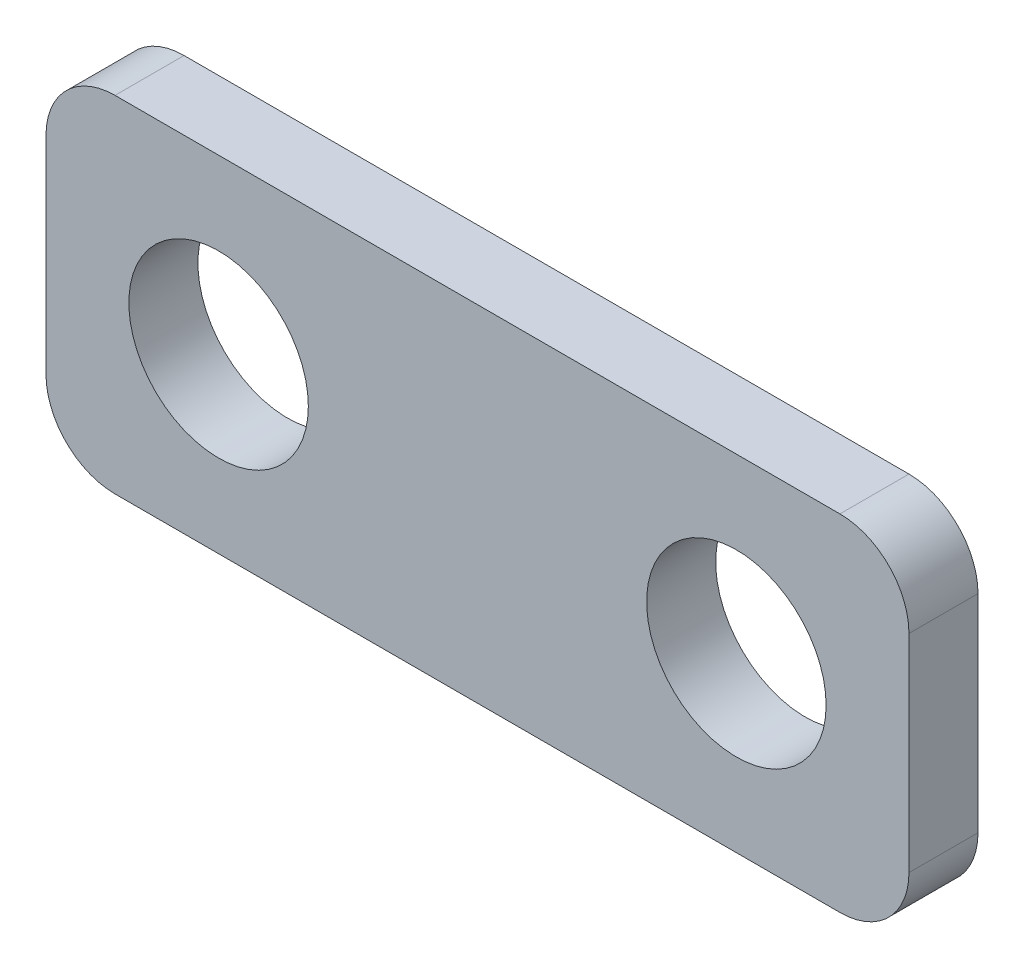
ISO-10303-21;
HEADER;
FILE_DESCRIPTION(('STEP AP214'),'2;1');
FILE_NAME('part.step','',(''),(''),'','','');
FILE_SCHEMA(('AUTOMOTIVE_DESIGN { 1 0 10303 214 1 1 1 1 }'));
ENDSEC;
DATA;
#1=APPLICATION_CONTEXT('core data for automotive mechanical design processes');
#2=APPLICATION_PROTOCOL_DEFINITION('international standard','automotive_design',2000,#1);
#3=PRODUCT_CONTEXT('',#1,'mechanical');
#4=PRODUCT('Part','Part','',(#3));
#5=PRODUCT_RELATED_PRODUCT_CATEGORY('part','',(#4));
#6=PRODUCT_DEFINITION_FORMATION('','',#4);
#7=PRODUCT_DEFINITION_CONTEXT('part definition',#1,'design');
#8=PRODUCT_DEFINITION('design','',#6,#7);
#9=PRODUCT_DEFINITION_SHAPE('','',#8);
#10=(LENGTH_UNIT() NAMED_UNIT(*) SI_UNIT(.MILLI.,.METRE.));
#11=(NAMED_UNIT(*) PLANE_ANGLE_UNIT() SI_UNIT($,.RADIAN.));
#12=(NAMED_UNIT(*) SI_UNIT($,.STERADIAN.) SOLID_ANGLE_UNIT());
#13=UNCERTAINTY_MEASURE_WITH_UNIT(LENGTH_MEASURE(1.E-05),#10,'distance_accuracy_value','');
#14=(GEOMETRIC_REPRESENTATION_CONTEXT(3) GLOBAL_UNCERTAINTY_ASSIGNED_CONTEXT((#13)) GLOBAL_UNIT_ASSIGNED_CONTEXT((#10,
#11,#12)) REPRESENTATION_CONTEXT('',''));
#15=CARTESIAN_POINT('',(0.,0.,0.));
#16=DIRECTION('',(0.,0.,1.));
#17=DIRECTION('',(1.,0.,0.));
#18=AXIS2_PLACEMENT_3D('',#15,#16,#17);
#19=CARTESIAN_POINT('',(29.21,2.54,2.54));
#20=DIRECTION('',(0.,0.,1.));
#21=DIRECTION('',(1.,0.,0.));
#22=AXIS2_PLACEMENT_3D('',#19,#20,#21);
#23=PLANE('',#22);
#24=CARTESIAN_POINT('',(6.35,6.35,2.54));
#25=DIRECTION('',(0.,0.,1.));
#26=DIRECTION('',(1.,0.,0.));
#27=AXIS2_PLACEMENT_3D('',#24,#25,#26);
#28=CIRCLE('',#27,3.302);
#29=CARTESIAN_POINT('',(9.652,6.35,2.54));
#30=VERTEX_POINT('',#29);
#31=EDGE_CURVE('E136',#30,#30,#28,.T.);
#32=ORIENTED_EDGE('',*,*,#31,.F.);
#33=EDGE_LOOP('',(#32));
#34=FACE_BOUND('',#33,.T.);
#35=CARTESIAN_POINT('',(29.21,2.54,2.54));
#36=DIRECTION('',(0.,0.,1.));
#37=DIRECTION('',(1.,0.,0.));
#38=AXIS2_PLACEMENT_3D('',#35,#36,#37);
#39=CIRCLE('',#38,2.54);
#40=CARTESIAN_POINT('',(29.21,0.,2.54));
#41=VERTEX_POINT('',#40);
#42=CARTESIAN_POINT('',(31.75,2.54000000000002,2.54));
#43=VERTEX_POINT('',#42);
#44=EDGE_CURVE('E147',#41,#43,#39,.T.);
#45=ORIENTED_EDGE('',*,*,#44,.T.);
#46=DIRECTION('',(0.,1.,0.));
#47=VECTOR('',#46,1.);
#48=CARTESIAN_POINT('',(31.75,2.54000000000002,2.54));
#49=LINE('',#48,#47);
#50=CARTESIAN_POINT('',(31.75,10.16,2.54));
#51=VERTEX_POINT('',#50);
#52=EDGE_CURVE('E95',#43,#51,#49,.T.);
#53=ORIENTED_EDGE('',*,*,#52,.T.);
#54=CARTESIAN_POINT('',(29.21,10.16,2.54));
#55=DIRECTION('',(0.,0.,1.));
#56=DIRECTION('',(-1.,0.,0.));
#57=AXIS2_PLACEMENT_3D('',#54,#55,#56);
#58=CIRCLE('',#57,2.54);
#59=CARTESIAN_POINT('',(29.21,12.7,2.54));
#60=VERTEX_POINT('',#59);
#61=EDGE_CURVE('E162',#51,#60,#58,.T.);
#62=ORIENTED_EDGE('',*,*,#61,.T.);
#63=DIRECTION('',(-1.,0.,0.));
#64=VECTOR('',#63,1.);
#65=CARTESIAN_POINT('',(2.54000000000002,12.7,2.54));
#66=LINE('',#65,#64);
#67=CARTESIAN_POINT('',(2.54000000000002,12.7,2.54));
#68=VERTEX_POINT('',#67);
#69=EDGE_CURVE('E175',#60,#68,#66,.T.);
#70=ORIENTED_EDGE('',*,*,#69,.T.);
#71=CARTESIAN_POINT('',(2.54,10.16,2.54));
#72=DIRECTION('',(0.,0.,1.));
#73=DIRECTION('',(-1.,0.,0.));
#74=AXIS2_PLACEMENT_3D('',#71,#72,#73);
#75=CIRCLE('',#74,2.54);
#76=CARTESIAN_POINT('',(0.,10.16,2.54));
#77=VERTEX_POINT('',#76);
#78=EDGE_CURVE('E114',#68,#77,#75,.T.);
#79=ORIENTED_EDGE('',*,*,#78,.T.);
#80=DIRECTION('',(0.,-1.,0.));
#81=VECTOR('',#80,1.);
#82=CARTESIAN_POINT('',(0.,2.54000000000002,2.54));
#83=LINE('',#82,#81);
#84=CARTESIAN_POINT('',(0.,2.54000000000002,2.54));
#85=VERTEX_POINT('',#84);
#86=EDGE_CURVE('E108',#77,#85,#83,.T.);
#87=ORIENTED_EDGE('',*,*,#86,.T.);
#88=CARTESIAN_POINT('',(2.54,2.54,2.54));
#89=DIRECTION('',(0.,0.,1.));
#90=DIRECTION('',(-1.,0.,0.));
#91=AXIS2_PLACEMENT_3D('',#88,#89,#90);
#92=CIRCLE('',#91,2.54);
#93=CARTESIAN_POINT('',(2.54000000000002,0.,2.54));
#94=VERTEX_POINT('',#93);
#95=EDGE_CURVE('E112',#85,#94,#92,.T.);
#96=ORIENTED_EDGE('',*,*,#95,.T.);
#97=DIRECTION('',(1.,0.,0.));
#98=VECTOR('',#97,1.);
#99=CARTESIAN_POINT('',(2.54000000000002,0.,2.54));
#100=LINE('',#99,#98);
#101=EDGE_CURVE('E52',#94,#41,#100,.T.);
#102=ORIENTED_EDGE('',*,*,#101,.T.);
#103=EDGE_LOOP('',(#45,#53,#62,#70,#79,#87,#96,#102));
#104=FACE_BOUND('',#103,.T.);
#105=CARTESIAN_POINT('',(25.4,6.35,2.54));
#106=DIRECTION('',(0.,0.,1.));
#107=DIRECTION('',(1.,0.,0.));
#108=AXIS2_PLACEMENT_3D('',#105,#106,#107);
#109=CIRCLE('',#108,3.302);
#110=CARTESIAN_POINT('',(28.702,6.35,2.54));
#111=VERTEX_POINT('',#110);
#112=EDGE_CURVE('E184',#111,#111,#109,.T.);
#113=ORIENTED_EDGE('',*,*,#112,.F.);
#114=EDGE_LOOP('',(#113));
#115=FACE_BOUND('',#114,.T.);
#116=ADVANCED_FACE('F35',(#34,#104,#115),#23,.T.);
#117=CARTESIAN_POINT('',(29.21,2.54,0.));
#118=DIRECTION('',(0.,0.,1.));
#119=DIRECTION('',(1.,0.,0.));
#120=AXIS2_PLACEMENT_3D('',#117,#118,#119);
#121=PLANE('',#120);
#122=CARTESIAN_POINT('',(29.21,2.54,0.));
#123=DIRECTION('',(0.,0.,1.));
#124=DIRECTION('',(1.,0.,0.));
#125=AXIS2_PLACEMENT_3D('',#122,#123,#124);
#126=CIRCLE('',#125,2.54);
#127=CARTESIAN_POINT('',(29.21,0.,0.));
#128=VERTEX_POINT('',#127);
#129=CARTESIAN_POINT('',(31.75,2.54000000000002,0.));
#130=VERTEX_POINT('',#129);
#131=EDGE_CURVE('E132',#128,#130,#126,.T.);
#132=ORIENTED_EDGE('',*,*,#131,.F.);
#133=DIRECTION('',(1.,0.,0.));
#134=VECTOR('',#133,1.);
#135=CARTESIAN_POINT('',(2.54000000000002,0.,0.));
#136=LINE('',#135,#134);
#137=CARTESIAN_POINT('',(2.54000000000002,0.,0.));
#138=VERTEX_POINT('',#137);
#139=EDGE_CURVE('E87',#138,#128,#136,.T.);
#140=ORIENTED_EDGE('',*,*,#139,.F.);
#141=CARTESIAN_POINT('',(2.54,2.54,0.));
#142=DIRECTION('',(0.,0.,1.));
#143=DIRECTION('',(-1.,0.,0.));
#144=AXIS2_PLACEMENT_3D('',#141,#142,#143);
#145=CIRCLE('',#144,2.54);
#146=CARTESIAN_POINT('',(0.,2.54000000000002,0.));
#147=VERTEX_POINT('',#146);
#148=EDGE_CURVE('E81',#147,#138,#145,.T.);
#149=ORIENTED_EDGE('',*,*,#148,.F.);
#150=DIRECTION('',(0.,-1.,0.));
#151=VECTOR('',#150,1.);
#152=CARTESIAN_POINT('',(0.,2.54000000000002,0.));
#153=LINE('',#152,#151);
#154=CARTESIAN_POINT('',(0.,10.16,0.));
#155=VERTEX_POINT('',#154);
#156=EDGE_CURVE('E122',#155,#147,#153,.T.);
#157=ORIENTED_EDGE('',*,*,#156,.F.);
#158=CARTESIAN_POINT('',(2.54,10.16,0.));
#159=DIRECTION('',(0.,0.,1.));
#160=DIRECTION('',(-1.,0.,0.));
#161=AXIS2_PLACEMENT_3D('',#158,#159,#160);
#162=CIRCLE('',#161,2.54);
#163=CARTESIAN_POINT('',(2.54000000000002,12.7,0.));
#164=VERTEX_POINT('',#163);
#165=EDGE_CURVE('E142',#164,#155,#162,.T.);
#166=ORIENTED_EDGE('',*,*,#165,.F.);
#167=DIRECTION('',(-1.,0.,0.));
#168=VECTOR('',#167,1.);
#169=CARTESIAN_POINT('',(2.54000000000002,12.7,0.));
#170=LINE('',#169,#168);
#171=CARTESIAN_POINT('',(29.21,12.7,0.));
#172=VERTEX_POINT('',#171);
#173=EDGE_CURVE('E140',#172,#164,#170,.T.);
#174=ORIENTED_EDGE('',*,*,#173,.F.);
#175=CARTESIAN_POINT('',(29.21,10.16,0.));
#176=DIRECTION('',(0.,0.,1.));
#177=DIRECTION('',(-1.,0.,0.));
#178=AXIS2_PLACEMENT_3D('',#175,#176,#177);
#179=CIRCLE('',#178,2.54);
#180=CARTESIAN_POINT('',(31.75,10.16,0.));
#181=VERTEX_POINT('',#180);
#182=EDGE_CURVE('E138',#181,#172,#179,.T.);
#183=ORIENTED_EDGE('',*,*,#182,.F.);
#184=DIRECTION('',(0.,1.,0.));
#185=VECTOR('',#184,1.);
#186=CARTESIAN_POINT('',(31.75,2.54000000000002,0.));
#187=LINE('',#186,#185);
#188=EDGE_CURVE('E135',#130,#181,#187,.T.);
#189=ORIENTED_EDGE('',*,*,#188,.F.);
#190=EDGE_LOOP('',(#132,#140,#149,#157,#166,#174,#183,#189));
#191=FACE_BOUND('',#190,.T.);
#192=CARTESIAN_POINT('',(6.35,6.35,0.));
#193=DIRECTION('',(0.,0.,1.));
#194=DIRECTION('',(1.,0.,0.));
#195=AXIS2_PLACEMENT_3D('',#192,#193,#194);
#196=CIRCLE('',#195,3.302);
#197=CARTESIAN_POINT('',(9.652,6.35,0.));
#198=VERTEX_POINT('',#197);
#199=EDGE_CURVE('E181',#198,#198,#196,.T.);
#200=ORIENTED_EDGE('',*,*,#199,.T.);
#201=EDGE_LOOP('',(#200));
#202=FACE_BOUND('',#201,.T.);
#203=CARTESIAN_POINT('',(25.4,6.35,0.));
#204=DIRECTION('',(0.,0.,1.));
#205=DIRECTION('',(1.,0.,0.));
#206=AXIS2_PLACEMENT_3D('',#203,#204,#205);
#207=CIRCLE('',#206,3.302);
#208=CARTESIAN_POINT('',(28.702,6.35,0.));
#209=VERTEX_POINT('',#208);
#210=EDGE_CURVE('E187',#209,#209,#207,.T.);
#211=ORIENTED_EDGE('',*,*,#210,.T.);
#212=EDGE_LOOP('',(#211));
#213=FACE_BOUND('',#212,.T.);
#214=ADVANCED_FACE('F166',(#191,#202,#213),#121,.F.);
#215=CARTESIAN_POINT('',(29.21,2.54,2.54));
#216=DIRECTION('',(0.,0.,-1.));
#217=DIRECTION('',(-1.,0.,0.));
#218=AXIS2_PLACEMENT_3D('',#215,#216,#217);
#219=CYLINDRICAL_SURFACE('',#218,2.54);
#220=ORIENTED_EDGE('',*,*,#131,.T.);
#221=DIRECTION('',(0.,0.,-1.));
#222=VECTOR('',#221,1.);
#223=CARTESIAN_POINT('',(31.75,2.54000000000002,2.54));
#224=LINE('',#223,#222);
#225=EDGE_CURVE('E11',#43,#130,#224,.T.);
#226=ORIENTED_EDGE('',*,*,#225,.F.);
#227=ORIENTED_EDGE('',*,*,#44,.F.);
#228=DIRECTION('',(0.,0.,-1.));
#229=VECTOR('',#228,1.);
#230=CARTESIAN_POINT('',(29.21,0.,2.54));
#231=LINE('',#230,#229);
#232=EDGE_CURVE('E128',#41,#128,#231,.T.);
#233=ORIENTED_EDGE('',*,*,#232,.T.);
#234=EDGE_LOOP('',(#220,#226,#227,#233));
#235=FACE_BOUND('',#234,.T.);
#236=ADVANCED_FACE('F37',(#235),#219,.T.);
#237=CARTESIAN_POINT('',(31.75,2.54000000000002,2.54));
#238=DIRECTION('',(-1.,0.,0.));
#239=DIRECTION('',(0.,0.,1.));
#240=AXIS2_PLACEMENT_3D('',#237,#238,#239);
#241=PLANE('',#240);
#242=ORIENTED_EDGE('',*,*,#188,.T.);
#243=DIRECTION('',(0.,0.,-1.));
#244=VECTOR('',#243,1.);
#245=CARTESIAN_POINT('',(31.75,10.16,2.54));
#246=LINE('',#245,#244);
#247=EDGE_CURVE('E44',#51,#181,#246,.T.);
#248=ORIENTED_EDGE('',*,*,#247,.F.);
#249=ORIENTED_EDGE('',*,*,#52,.F.);
#250=ORIENTED_EDGE('',*,*,#225,.T.);
#251=EDGE_LOOP('',(#242,#248,#249,#250));
#252=FACE_BOUND('',#251,.T.);
#253=ADVANCED_FACE('F219',(#252),#241,.F.);
#254=CARTESIAN_POINT('',(29.21,10.16,2.54));
#255=DIRECTION('',(0.,0.,-1.));
#256=DIRECTION('',(-1.,0.,0.));
#257=AXIS2_PLACEMENT_3D('',#254,#255,#256);
#258=CYLINDRICAL_SURFACE('',#257,2.54);
#259=ORIENTED_EDGE('',*,*,#182,.T.);
#260=DIRECTION('',(0.,0.,-1.));
#261=VECTOR('',#260,1.);
#262=CARTESIAN_POINT('',(29.21,12.7,2.54));
#263=LINE('',#262,#261);
#264=EDGE_CURVE('E154',#60,#172,#263,.T.);
#265=ORIENTED_EDGE('',*,*,#264,.F.);
#266=ORIENTED_EDGE('',*,*,#61,.F.);
#267=ORIENTED_EDGE('',*,*,#247,.T.);
#268=EDGE_LOOP('',(#259,#265,#266,#267));
#269=FACE_BOUND('',#268,.T.);
#270=ADVANCED_FACE('F160',(#269),#258,.T.);
#271=CARTESIAN_POINT('',(2.54000000000002,12.7,2.54));
#272=DIRECTION('',(0.,-1.,0.));
#273=DIRECTION('',(0.,0.,-1.));
#274=AXIS2_PLACEMENT_3D('',#271,#272,#273);
#275=PLANE('',#274);
#276=ORIENTED_EDGE('',*,*,#173,.T.);
#277=DIRECTION('',(0.,0.,-1.));
#278=VECTOR('',#277,1.);
#279=CARTESIAN_POINT('',(2.54000000000002,12.7,2.54));
#280=LINE('',#279,#278);
#281=EDGE_CURVE('E151',#68,#164,#280,.T.);
#282=ORIENTED_EDGE('',*,*,#281,.F.);
#283=ORIENTED_EDGE('',*,*,#69,.F.);
#284=ORIENTED_EDGE('',*,*,#264,.T.);
#285=EDGE_LOOP('',(#276,#282,#283,#284));
#286=FACE_BOUND('',#285,.T.);
#287=ADVANCED_FACE('F171',(#286),#275,.F.);
#288=CARTESIAN_POINT('',(2.54,10.16,2.54));
#289=DIRECTION('',(0.,0.,-1.));
#290=DIRECTION('',(-1.,0.,0.));
#291=AXIS2_PLACEMENT_3D('',#288,#289,#290);
#292=CYLINDRICAL_SURFACE('',#291,2.54);
#293=ORIENTED_EDGE('',*,*,#165,.T.);
#294=DIRECTION('',(0.,0.,-1.));
#295=VECTOR('',#294,1.);
#296=CARTESIAN_POINT('',(0.,10.16,2.54));
#297=LINE('',#296,#295);
#298=EDGE_CURVE('E123',#77,#155,#297,.T.);
#299=ORIENTED_EDGE('',*,*,#298,.F.);
#300=ORIENTED_EDGE('',*,*,#78,.F.);
#301=ORIENTED_EDGE('',*,*,#281,.T.);
#302=EDGE_LOOP('',(#293,#299,#300,#301));
#303=FACE_BOUND('',#302,.T.);
#304=ADVANCED_FACE('F174',(#303),#292,.T.);
#305=CARTESIAN_POINT('',(0.,2.54000000000002,2.54));
#306=DIRECTION('',(1.,0.,0.));
#307=DIRECTION('',(0.,0.,-1.));
#308=AXIS2_PLACEMENT_3D('',#305,#306,#307);
#309=PLANE('',#308);
#310=ORIENTED_EDGE('',*,*,#156,.T.);
#311=DIRECTION('',(0.,0.,-1.));
#312=VECTOR('',#311,1.);
#313=CARTESIAN_POINT('',(0.,2.54000000000002,2.54));
#314=LINE('',#313,#312);
#315=EDGE_CURVE('E119',#85,#147,#314,.T.);
#316=ORIENTED_EDGE('',*,*,#315,.F.);
#317=ORIENTED_EDGE('',*,*,#86,.F.);
#318=ORIENTED_EDGE('',*,*,#298,.T.);
#319=EDGE_LOOP('',(#310,#316,#317,#318));
#320=FACE_BOUND('',#319,.T.);
#321=ADVANCED_FACE('F120',(#320),#309,.F.);
#322=CARTESIAN_POINT('',(2.54,2.54,2.54));
#323=DIRECTION('',(0.,0.,-1.));
#324=DIRECTION('',(-1.,0.,0.));
#325=AXIS2_PLACEMENT_3D('',#322,#323,#324);
#326=CYLINDRICAL_SURFACE('',#325,2.54);
#327=ORIENTED_EDGE('',*,*,#148,.T.);
#328=DIRECTION('',(0.,0.,-1.));
#329=VECTOR('',#328,1.);
#330=CARTESIAN_POINT('',(2.54000000000002,0.,2.54));
#331=LINE('',#330,#329);
#332=EDGE_CURVE('E124',#94,#138,#331,.T.);
#333=ORIENTED_EDGE('',*,*,#332,.F.);
#334=ORIENTED_EDGE('',*,*,#95,.F.);
#335=ORIENTED_EDGE('',*,*,#315,.T.);
#336=EDGE_LOOP('',(#327,#333,#334,#335));
#337=FACE_BOUND('',#336,.T.);
#338=ADVANCED_FACE('F126',(#337),#326,.T.);
#339=CARTESIAN_POINT('',(2.54000000000002,0.,2.54));
#340=DIRECTION('',(0.,1.,0.));
#341=DIRECTION('',(0.,0.,1.));
#342=AXIS2_PLACEMENT_3D('',#339,#340,#341);
#343=PLANE('',#342);
#344=ORIENTED_EDGE('',*,*,#139,.T.);
#345=ORIENTED_EDGE('',*,*,#232,.F.);
#346=ORIENTED_EDGE('',*,*,#101,.F.);
#347=ORIENTED_EDGE('',*,*,#332,.T.);
#348=EDGE_LOOP('',(#344,#345,#346,#347));
#349=FACE_BOUND('',#348,.T.);
#350=ADVANCED_FACE('F207',(#349),#343,.F.);
#351=CARTESIAN_POINT('',(6.35,6.35,2.54));
#352=DIRECTION('',(0.,0.,-1.));
#353=DIRECTION('',(-1.,0.,0.));
#354=AXIS2_PLACEMENT_3D('',#351,#352,#353);
#355=CYLINDRICAL_SURFACE('',#354,3.302);
#356=ORIENTED_EDGE('',*,*,#31,.T.);
#357=EDGE_LOOP('',(#356));
#358=FACE_BOUND('',#357,.T.);
#359=ORIENTED_EDGE('',*,*,#199,.F.);
#360=EDGE_LOOP('',(#359));
#361=FACE_BOUND('',#360,.T.);
#362=ADVANCED_FACE('F204',(#358,#361),#355,.F.);
#363=CARTESIAN_POINT('',(25.4,6.35,2.54));
#364=DIRECTION('',(0.,0.,-1.));
#365=DIRECTION('',(-1.,0.,0.));
#366=AXIS2_PLACEMENT_3D('',#363,#364,#365);
#367=CYLINDRICAL_SURFACE('',#366,3.302);
#368=ORIENTED_EDGE('',*,*,#112,.T.);
#369=EDGE_LOOP('',(#368));
#370=FACE_BOUND('',#369,.T.);
#371=ORIENTED_EDGE('',*,*,#210,.F.);
#372=EDGE_LOOP('',(#371));
#373=FACE_BOUND('',#372,.T.);
#374=ADVANCED_FACE('F193',(#370,#373),#367,.F.);
#375=CLOSED_SHELL('',(#116,#214,#236,#253,#270,#287,#304,#321,#338,#350,#362,#374));
#376=MANIFOLD_SOLID_BREP('B2',#375);
#377=ADVANCED_BREP_SHAPE_REPRESENTATION('',(#18,#376),#14);
#378=SHAPE_DEFINITION_REPRESENTATION(#9,#377);
ENDSEC;
END-ISO-10303-21;
